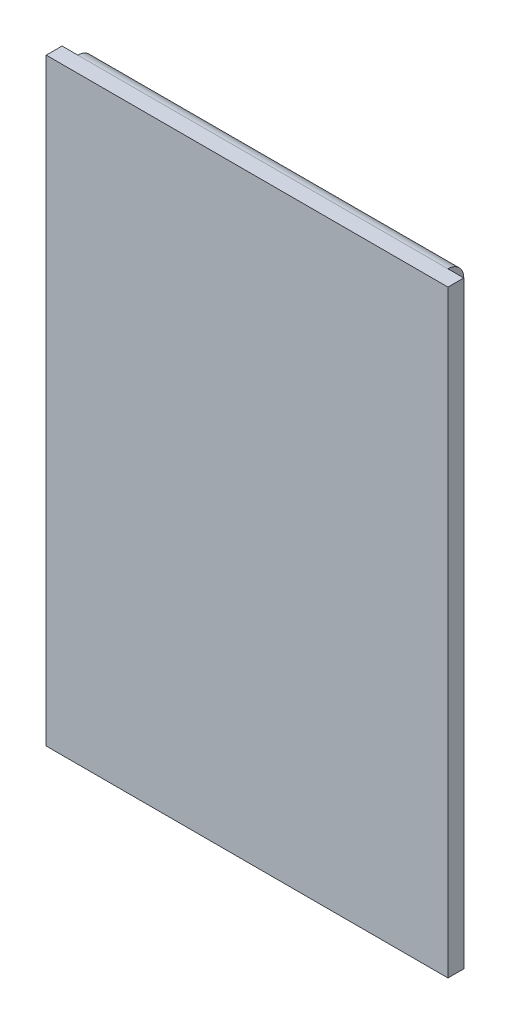
ISO-10303-21;
HEADER;
FILE_DESCRIPTION(('STEP AP214'),'2;1');
FILE_NAME('part.step','',(''),(''),'','','');
FILE_SCHEMA(('AUTOMOTIVE_DESIGN { 1 0 10303 214 1 1 1 1 }'));
ENDSEC;
DATA;
#1=APPLICATION_CONTEXT('core data for automotive mechanical design processes');
#2=APPLICATION_PROTOCOL_DEFINITION('international standard','automotive_design',2000,#1);
#3=PRODUCT_CONTEXT('',#1,'mechanical');
#4=PRODUCT('Part','Part','',(#3));
#5=PRODUCT_RELATED_PRODUCT_CATEGORY('part','',(#4));
#6=PRODUCT_DEFINITION_FORMATION('','',#4);
#7=PRODUCT_DEFINITION_CONTEXT('part definition',#1,'design');
#8=PRODUCT_DEFINITION('design','',#6,#7);
#9=PRODUCT_DEFINITION_SHAPE('','',#8);
#10=(LENGTH_UNIT() NAMED_UNIT(*) SI_UNIT(.MILLI.,.METRE.));
#11=(NAMED_UNIT(*) PLANE_ANGLE_UNIT() SI_UNIT($,.RADIAN.));
#12=(NAMED_UNIT(*) SI_UNIT($,.STERADIAN.) SOLID_ANGLE_UNIT());
#13=UNCERTAINTY_MEASURE_WITH_UNIT(LENGTH_MEASURE(1.E-05),#10,'distance_accuracy_value','');
#14=(GEOMETRIC_REPRESENTATION_CONTEXT(3) GLOBAL_UNCERTAINTY_ASSIGNED_CONTEXT((#13)) GLOBAL_UNIT_ASSIGNED_CONTEXT((#10,
#11,#12)) REPRESENTATION_CONTEXT('',''));
#15=CARTESIAN_POINT('',(0.,0.,0.));
#16=DIRECTION('',(0.,0.,1.));
#17=DIRECTION('',(1.,0.,0.));
#18=AXIS2_PLACEMENT_3D('',#15,#16,#17);
#19=CARTESIAN_POINT('',(-19.2071728395057,75.66,-15.2836751765689));
#20=DIRECTION('',(0.,0.,1.));
#21=DIRECTION('',(1.,0.,0.));
#22=AXIS2_PLACEMENT_3D('',#19,#20,#21);
#23=PLANE('',#22);
#24=DIRECTION('',(0.,-1.,0.));
#25=VECTOR('',#24,1.);
#26=CARTESIAN_POINT('',(-19.2071728395057,75.66,-15.2836751765689));
#27=LINE('',#26,#25);
#28=CARTESIAN_POINT('',(-19.2071728395057,73.66,-15.2836751765689));
#29=VERTEX_POINT('',#28);
#30=CARTESIAN_POINT('',(-19.2071728395057,2.,-15.2836751765689));
#31=VERTEX_POINT('',#30);
#32=EDGE_CURVE('E197',#29,#31,#27,.T.);
#33=ORIENTED_EDGE('',*,*,#32,.F.);
#34=DIRECTION('',(-1.,0.,0.));
#35=VECTOR('',#34,1.);
#36=CARTESIAN_POINT('',(27.5928271604943,73.66,-15.2836751765689));
#37=LINE('',#36,#35);
#38=CARTESIAN_POINT('',(27.5928271604943,73.66,-15.2836751765689));
#39=VERTEX_POINT('',#38);
#40=EDGE_CURVE('E43',#29,#39,#37,.F.);
#41=ORIENTED_EDGE('',*,*,#40,.T.);
#42=DIRECTION('',(0.,-1.,0.));
#43=VECTOR('',#42,1.);
#44=CARTESIAN_POINT('',(27.5928271604943,75.66,-15.2836751765689));
#45=LINE('',#44,#43);
#46=CARTESIAN_POINT('',(27.5928271604943,2.,-15.2836751765689));
#47=VERTEX_POINT('',#46);
#48=EDGE_CURVE('E199',#39,#47,#45,.T.);
#49=ORIENTED_EDGE('',*,*,#48,.T.);
#50=DIRECTION('',(1.,0.,0.));
#51=VECTOR('',#50,1.);
#52=CARTESIAN_POINT('',(-41.4071728395057,2.,-15.2836751765689));
#53=LINE('',#52,#51);
#54=EDGE_CURVE('E151',#31,#47,#53,.T.);
#55=ORIENTED_EDGE('',*,*,#54,.F.);
#56=EDGE_LOOP('',(#33,#41,#49,#55));
#57=FACE_BOUND('',#56,.T.);
#58=DIRECTION('',(1.,0.,0.));
#59=VECTOR('',#58,1.);
#60=CARTESIAN_POINT('',(0.,73.4413009949766,-15.2836751765689));
#61=LINE('',#60,#59);
#62=CARTESIAN_POINT('',(-2.61434567901141,73.4413009949766,-15.2836751765689));
#63=VERTEX_POINT('',#62);
#64=CARTESIAN_POINT('',(9.38565432098859,73.4413009949766,-15.2836751765689));
#65=VERTEX_POINT('',#64);
#66=EDGE_CURVE('E146',#63,#65,#61,.T.);
#67=ORIENTED_EDGE('',*,*,#66,.F.);
#68=DIRECTION('',(0.,-1.,0.));
#69=VECTOR('',#68,1.);
#70=CARTESIAN_POINT('',(-2.61434567901141,0.,-15.2836751765689));
#71=LINE('',#70,#69);
#72=CARTESIAN_POINT('',(-2.61434567901141,71.4413009949766,-15.2836751765689));
#73=VERTEX_POINT('',#72);
#74=EDGE_CURVE('E142',#63,#73,#71,.T.);
#75=ORIENTED_EDGE('',*,*,#74,.T.);
#76=DIRECTION('',(1.,0.,0.));
#77=VECTOR('',#76,1.);
#78=CARTESIAN_POINT('',(0.,71.4413009949766,-15.2836751765689));
#79=LINE('',#78,#77);
#80=CARTESIAN_POINT('',(9.38565432098859,71.4413009949766,-15.2836751765689));
#81=VERTEX_POINT('',#80);
#82=EDGE_CURVE('E50',#73,#81,#79,.T.);
#83=ORIENTED_EDGE('',*,*,#82,.T.);
#84=DIRECTION('',(0.,-1.,0.));
#85=VECTOR('',#84,1.);
#86=CARTESIAN_POINT('',(9.38565432098859,0.,-15.2836751765689));
#87=LINE('',#86,#85);
#88=EDGE_CURVE('E339',#65,#81,#87,.T.);
#89=ORIENTED_EDGE('',*,*,#88,.F.);
#90=EDGE_LOOP('',(#67,#75,#83,#89));
#91=FACE_BOUND('',#90,.T.);
#92=ADVANCED_FACE('F35',(#57,#91),#23,.F.);
#93=CARTESIAN_POINT('',(29.5928271604943,75.66,-13.2836751765689));
#94=DIRECTION('',(-1.,0.,0.));
#95=DIRECTION('',(0.,0.,1.));
#96=AXIS2_PLACEMENT_3D('',#93,#94,#95);
#97=PLANE('',#96);
#98=DIRECTION('',(0.,0.,-1.));
#99=VECTOR('',#98,1.);
#100=CARTESIAN_POINT('',(29.5928271604943,0.,-13.2836751765689));
#101=LINE('',#100,#99);
#102=CARTESIAN_POINT('',(29.5928271604943,0.,-11.2836751765689));
#103=VERTEX_POINT('',#102);
#104=CARTESIAN_POINT('',(29.5928271604943,0.,-13.2836751765689));
#105=VERTEX_POINT('',#104);
#106=EDGE_CURVE('E164',#103,#105,#101,.T.);
#107=ORIENTED_EDGE('',*,*,#106,.T.);
#108=DIRECTION('',(0.,-1.,0.));
#109=VECTOR('',#108,1.);
#110=CARTESIAN_POINT('',(29.5928271604943,75.66,-13.2836751765689));
#111=LINE('',#110,#109);
#112=CARTESIAN_POINT('',(29.5928271604943,75.66,-13.2836751765689));
#113=VERTEX_POINT('',#112);
#114=EDGE_CURVE('E204',#113,#105,#111,.T.);
#115=ORIENTED_EDGE('',*,*,#114,.F.);
#116=DIRECTION('',(0.,0.,-1.));
#117=VECTOR('',#116,1.);
#118=CARTESIAN_POINT('',(29.5928271604943,75.66,-13.2836751765689));
#119=LINE('',#118,#117);
#120=CARTESIAN_POINT('',(29.5928271604943,75.66,-11.2836751765689));
#121=VERTEX_POINT('',#120);
#122=EDGE_CURVE('E165',#121,#113,#119,.T.);
#123=ORIENTED_EDGE('',*,*,#122,.F.);
#124=DIRECTION('',(0.,-1.,0.));
#125=VECTOR('',#124,1.);
#126=CARTESIAN_POINT('',(29.5928271604943,75.66,-11.2836751765689));
#127=LINE('',#126,#125);
#128=EDGE_CURVE('E178',#121,#103,#127,.T.);
#129=ORIENTED_EDGE('',*,*,#128,.T.);
#130=EDGE_LOOP('',(#107,#115,#123,#129));
#131=FACE_BOUND('',#130,.T.);
#132=ADVANCED_FACE('F246',(#131),#97,.F.);
#133=CARTESIAN_POINT('',(27.5928271604943,75.66,-15.2836751765689));
#134=DIRECTION('',(-1.,0.,0.));
#135=DIRECTION('',(0.,0.,1.));
#136=AXIS2_PLACEMENT_3D('',#133,#134,#135);
#137=PLANE('',#136);
#138=ORIENTED_EDGE('',*,*,#48,.F.);
#139=CARTESIAN_POINT('',(27.5928271604943,73.66,-13.2836751765689));
#140=DIRECTION('',(-1.,0.,0.));
#141=DIRECTION('',(0.,0.,1.));
#142=AXIS2_PLACEMENT_3D('',#139,#140,#141);
#143=CIRCLE('',#142,2.);
#144=CARTESIAN_POINT('',(27.5928271604943,75.66,-13.2836751765689));
#145=VERTEX_POINT('',#144);
#146=EDGE_CURVE('E11',#39,#145,#143,.F.);
#147=ORIENTED_EDGE('',*,*,#146,.T.);
#148=DIRECTION('',(0.,-1.,0.));
#149=VECTOR('',#148,1.);
#150=CARTESIAN_POINT('',(27.5928271604943,75.66,-13.2836751765689));
#151=LINE('',#150,#149);
#152=CARTESIAN_POINT('',(27.5928271604943,2.,-13.2836751765689));
#153=VERTEX_POINT('',#152);
#154=EDGE_CURVE('E201',#145,#153,#151,.T.);
#155=ORIENTED_EDGE('',*,*,#154,.T.);
#156=DIRECTION('',(0.,0.,1.));
#157=VECTOR('',#156,1.);
#158=CARTESIAN_POINT('',(27.5928271604943,2.,-15.2836751765689));
#159=LINE('',#158,#157);
#160=EDGE_CURVE('E148',#47,#153,#159,.T.);
#161=ORIENTED_EDGE('',*,*,#160,.F.);
#162=EDGE_LOOP('',(#138,#147,#155,#161));
#163=FACE_BOUND('',#162,.T.);
#164=ADVANCED_FACE('F222',(#163),#137,.F.);
#165=CARTESIAN_POINT('',(-19.2071728395057,75.66,-15.2836751765689));
#166=DIRECTION('',(1.,0.,0.));
#167=DIRECTION('',(0.,0.,-1.));
#168=AXIS2_PLACEMENT_3D('',#165,#166,#167);
#169=PLANE('',#168);
#170=DIRECTION('',(0.,-1.,0.));
#171=VECTOR('',#170,1.);
#172=CARTESIAN_POINT('',(-19.2071728395057,75.66,-13.2836751765689));
#173=LINE('',#172,#171);
#174=CARTESIAN_POINT('',(-19.2071728395057,75.66,-13.2836751765689));
#175=VERTEX_POINT('',#174);
#176=CARTESIAN_POINT('',(-19.2071728395057,2.,-13.2836751765689));
#177=VERTEX_POINT('',#176);
#178=EDGE_CURVE('E194',#175,#177,#173,.T.);
#179=ORIENTED_EDGE('',*,*,#178,.F.);
#180=CARTESIAN_POINT('',(-19.2071728395057,73.66,-13.2836751765689));
#181=DIRECTION('',(1.,0.,0.));
#182=DIRECTION('',(0.,0.,-1.));
#183=AXIS2_PLACEMENT_3D('',#180,#181,#182);
#184=CIRCLE('',#183,2.);
#185=EDGE_CURVE('E210',#175,#29,#184,.F.);
#186=ORIENTED_EDGE('',*,*,#185,.T.);
#187=ORIENTED_EDGE('',*,*,#32,.T.);
#188=DIRECTION('',(0.,0.,1.));
#189=VECTOR('',#188,1.);
#190=CARTESIAN_POINT('',(-19.2071728395057,2.,-15.2836751765688));
#191=LINE('',#190,#189);
#192=EDGE_CURVE('E159',#31,#177,#191,.T.);
#193=ORIENTED_EDGE('',*,*,#192,.T.);
#194=EDGE_LOOP('',(#179,#186,#187,#193));
#195=FACE_BOUND('',#194,.T.);
#196=ADVANCED_FACE('F213',(#195),#169,.F.);
#197=CARTESIAN_POINT('',(-21.2071728395057,75.66,-13.2836751765689));
#198=DIRECTION('',(0.,0.,1.));
#199=DIRECTION('',(1.,0.,0.));
#200=AXIS2_PLACEMENT_3D('',#197,#198,#199);
#201=PLANE('',#200);
#202=ORIENTED_EDGE('',*,*,#178,.T.);
#203=DIRECTION('',(1.,0.,0.));
#204=VECTOR('',#203,1.);
#205=CARTESIAN_POINT('',(-41.4071728395057,2.,-13.2836751765689));
#206=LINE('',#205,#204);
#207=EDGE_CURVE('E157',#177,#153,#206,.T.);
#208=ORIENTED_EDGE('',*,*,#207,.T.);
#209=ORIENTED_EDGE('',*,*,#154,.F.);
#210=DIRECTION('',(-1.,0.,0.));
#211=VECTOR('',#210,1.);
#212=CARTESIAN_POINT('',(29.5928271604943,75.66,-13.2836751765689));
#213=LINE('',#212,#211);
#214=EDGE_CURVE('E168',#113,#145,#213,.T.);
#215=ORIENTED_EDGE('',*,*,#214,.F.);
#216=ORIENTED_EDGE('',*,*,#114,.T.);
#217=DIRECTION('',(-1.,0.,0.));
#218=VECTOR('',#217,1.);
#219=CARTESIAN_POINT('',(-21.2071728395057,0.,-13.2836751765689));
#220=LINE('',#219,#218);
#221=CARTESIAN_POINT('',(-21.2071728395057,0.,-13.2836751765689));
#222=VERTEX_POINT('',#221);
#223=EDGE_CURVE('E181',#105,#222,#220,.T.);
#224=ORIENTED_EDGE('',*,*,#223,.T.);
#225=DIRECTION('',(0.,-1.,0.));
#226=VECTOR('',#225,1.);
#227=CARTESIAN_POINT('',(-21.2071728395057,75.66,-13.2836751765689));
#228=LINE('',#227,#226);
#229=CARTESIAN_POINT('',(-21.2071728395057,75.66,-13.2836751765689));
#230=VERTEX_POINT('',#229);
#231=EDGE_CURVE('E192',#230,#222,#228,.T.);
#232=ORIENTED_EDGE('',*,*,#231,.F.);
#233=DIRECTION('',(-1.,0.,0.));
#234=VECTOR('',#233,1.);
#235=CARTESIAN_POINT('',(-21.2071728395057,75.66,-13.2836751765689));
#236=LINE('',#235,#234);
#237=EDGE_CURVE('E172',#175,#230,#236,.T.);
#238=ORIENTED_EDGE('',*,*,#237,.F.);
#239=EDGE_LOOP('',(#202,#208,#209,#215,#216,#224,#232,#238));
#240=FACE_BOUND('',#239,.T.);
#241=ADVANCED_FACE('F230',(#240),#201,.F.);
#242=CARTESIAN_POINT('',(-21.2071728395057,75.66,-13.2836751765689));
#243=DIRECTION('',(1.,0.,0.));
#244=DIRECTION('',(0.,0.,-1.));
#245=AXIS2_PLACEMENT_3D('',#242,#243,#244);
#246=PLANE('',#245);
#247=DIRECTION('',(0.,0.,1.));
#248=VECTOR('',#247,1.);
#249=CARTESIAN_POINT('',(-21.2071728395057,0.,-13.2836751765689));
#250=LINE('',#249,#248);
#251=CARTESIAN_POINT('',(-21.2071728395057,0.,-11.2836751765689));
#252=VERTEX_POINT('',#251);
#253=EDGE_CURVE('E184',#222,#252,#250,.T.);
#254=ORIENTED_EDGE('',*,*,#253,.T.);
#255=DIRECTION('',(0.,-1.,0.));
#256=VECTOR('',#255,1.);
#257=CARTESIAN_POINT('',(-21.2071728395057,75.66,-11.2836751765689));
#258=LINE('',#257,#256);
#259=CARTESIAN_POINT('',(-21.2071728395057,75.66,-11.2836751765689));
#260=VERTEX_POINT('',#259);
#261=EDGE_CURVE('E189',#260,#252,#258,.T.);
#262=ORIENTED_EDGE('',*,*,#261,.F.);
#263=DIRECTION('',(0.,0.,1.));
#264=VECTOR('',#263,1.);
#265=CARTESIAN_POINT('',(-21.2071728395057,75.66,-13.2836751765689));
#266=LINE('',#265,#264);
#267=EDGE_CURVE('E174',#230,#260,#266,.T.);
#268=ORIENTED_EDGE('',*,*,#267,.F.);
#269=ORIENTED_EDGE('',*,*,#231,.T.);
#270=EDGE_LOOP('',(#254,#262,#268,#269));
#271=FACE_BOUND('',#270,.T.);
#272=ADVANCED_FACE('F264',(#271),#246,.F.);
#273=CARTESIAN_POINT('',(-21.2071728395057,75.66,-11.2836751765689));
#274=DIRECTION('',(0.,0.,-1.));
#275=DIRECTION('',(-1.,0.,0.));
#276=AXIS2_PLACEMENT_3D('',#273,#274,#275);
#277=PLANE('',#276);
#278=DIRECTION('',(1.,0.,0.));
#279=VECTOR('',#278,1.);
#280=CARTESIAN_POINT('',(-21.2071728395057,0.,-11.2836751765689));
#281=LINE('',#280,#279);
#282=EDGE_CURVE('E169',#252,#103,#281,.T.);
#283=ORIENTED_EDGE('',*,*,#282,.T.);
#284=ORIENTED_EDGE('',*,*,#128,.F.);
#285=DIRECTION('',(1.,0.,0.));
#286=VECTOR('',#285,1.);
#287=CARTESIAN_POINT('',(-21.2071728395057,75.66,-11.2836751765689));
#288=LINE('',#287,#286);
#289=EDGE_CURVE('E176',#260,#121,#288,.T.);
#290=ORIENTED_EDGE('',*,*,#289,.F.);
#291=ORIENTED_EDGE('',*,*,#261,.T.);
#292=EDGE_LOOP('',(#283,#284,#290,#291));
#293=FACE_BOUND('',#292,.T.);
#294=ADVANCED_FACE('F269',(#293),#277,.F.);
#295=CARTESIAN_POINT('',(0.,75.66,0.));
#296=DIRECTION('',(0.,1.,0.));
#297=DIRECTION('',(0.,0.,1.));
#298=AXIS2_PLACEMENT_3D('',#295,#296,#297);
#299=PLANE('',#298);
#300=ORIENTED_EDGE('',*,*,#214,.T.);
#301=DIRECTION('',(-1.,0.,0.));
#302=VECTOR('',#301,1.);
#303=CARTESIAN_POINT('',(-19.2071728395057,75.66,-13.2836751765689));
#304=LINE('',#303,#302);
#305=EDGE_CURVE('E207',#145,#175,#304,.T.);
#306=ORIENTED_EDGE('',*,*,#305,.T.);
#307=ORIENTED_EDGE('',*,*,#237,.T.);
#308=ORIENTED_EDGE('',*,*,#267,.T.);
#309=ORIENTED_EDGE('',*,*,#289,.T.);
#310=ORIENTED_EDGE('',*,*,#122,.T.);
#311=EDGE_LOOP('',(#300,#306,#307,#308,#309,#310));
#312=FACE_BOUND('',#311,.T.);
#313=ADVANCED_FACE('F226',(#312),#299,.T.);
#314=CARTESIAN_POINT('',(0.,0.,0.));
#315=DIRECTION('',(0.,1.,0.));
#316=DIRECTION('',(0.,0.,1.));
#317=AXIS2_PLACEMENT_3D('',#314,#315,#316);
#318=PLANE('',#317);
#319=ORIENTED_EDGE('',*,*,#223,.F.);
#320=ORIENTED_EDGE('',*,*,#106,.F.);
#321=ORIENTED_EDGE('',*,*,#282,.F.);
#322=ORIENTED_EDGE('',*,*,#253,.F.);
#323=EDGE_LOOP('',(#319,#320,#321,#322));
#324=FACE_BOUND('',#323,.T.);
#325=ADVANCED_FACE('F234',(#324),#318,.F.);
#326=CARTESIAN_POINT('',(-41.4071728395057,2.,-15.2836751765689));
#327=DIRECTION('',(0.,1.,0.));
#328=DIRECTION('',(0.,0.,1.));
#329=AXIS2_PLACEMENT_3D('',#326,#327,#328);
#330=PLANE('',#329);
#331=ORIENTED_EDGE('',*,*,#54,.T.);
#332=ORIENTED_EDGE('',*,*,#160,.T.);
#333=ORIENTED_EDGE('',*,*,#207,.F.);
#334=ORIENTED_EDGE('',*,*,#192,.F.);
#335=EDGE_LOOP('',(#331,#332,#333,#334));
#336=FACE_BOUND('',#335,.T.);
#337=ADVANCED_FACE('F232',(#336),#330,.F.);
#338=CARTESIAN_POINT('',(0.,73.66,-13.2836751765689));
#339=DIRECTION('',(1.,0.,0.));
#340=DIRECTION('',(0.,0.,-1.));
#341=AXIS2_PLACEMENT_3D('',#338,#339,#340);
#342=CYLINDRICAL_SURFACE('',#341,2.);
#343=ORIENTED_EDGE('',*,*,#146,.F.);
#344=ORIENTED_EDGE('',*,*,#40,.F.);
#345=ORIENTED_EDGE('',*,*,#185,.F.);
#346=ORIENTED_EDGE('',*,*,#305,.F.);
#347=EDGE_LOOP('',(#343,#344,#345,#346));
#348=FACE_BOUND('',#347,.T.);
#349=ADVANCED_FACE('F37',(#348),#342,.T.);
#350=CARTESIAN_POINT('',(0.,73.4413009949766,-16.2836751765688));
#351=DIRECTION('',(0.,-1.,0.));
#352=DIRECTION('',(1.,0.,0.));
#353=AXIS2_PLACEMENT_3D('',#350,#351,#352);
#354=PLANE('',#353);
#355=ORIENTED_EDGE('',*,*,#66,.T.);
#356=DIRECTION('',(0.,0.,1.));
#357=VECTOR('',#356,1.);
#358=CARTESIAN_POINT('',(9.38565432098859,73.4413009949766,-16.2836751765688));
#359=LINE('',#358,#357);
#360=CARTESIAN_POINT('',(9.38565432098859,73.4413009949766,-16.2836751765688));
#361=VERTEX_POINT('',#360);
#362=EDGE_CURVE('E127',#361,#65,#359,.T.);
#363=ORIENTED_EDGE('',*,*,#362,.F.);
#364=DIRECTION('',(1.,0.,0.));
#365=VECTOR('',#364,1.);
#366=CARTESIAN_POINT('',(0.,73.4413009949766,-16.2836751765688));
#367=LINE('',#366,#365);
#368=CARTESIAN_POINT('',(-2.61434567901141,73.4413009949766,-16.2836751765688));
#369=VERTEX_POINT('',#368);
#370=EDGE_CURVE('E134',#369,#361,#367,.T.);
#371=ORIENTED_EDGE('',*,*,#370,.F.);
#372=DIRECTION('',(0.,0.,1.));
#373=VECTOR('',#372,1.);
#374=CARTESIAN_POINT('',(-2.61434567901141,73.4413009949766,-16.2836751765688));
#375=LINE('',#374,#373);
#376=EDGE_CURVE('E337',#369,#63,#375,.T.);
#377=ORIENTED_EDGE('',*,*,#376,.T.);
#378=EDGE_LOOP('',(#355,#363,#371,#377));
#379=FACE_BOUND('',#378,.T.);
#380=ADVANCED_FACE('F144',(#379),#354,.F.);
#381=CARTESIAN_POINT('',(9.38565432098859,0.,-16.2836751765688));
#382=DIRECTION('',(-1.,0.,0.));
#383=DIRECTION('',(0.,0.,1.));
#384=AXIS2_PLACEMENT_3D('',#381,#382,#383);
#385=PLANE('',#384);
#386=ORIENTED_EDGE('',*,*,#88,.T.);
#387=DIRECTION('',(0.,0.,1.));
#388=VECTOR('',#387,1.);
#389=CARTESIAN_POINT('',(9.38565432098859,71.4413009949766,-16.2836751765688));
#390=LINE('',#389,#388);
#391=CARTESIAN_POINT('',(9.38565432098859,71.4413009949766,-16.2836751765688));
#392=VERTEX_POINT('',#391);
#393=EDGE_CURVE('E129',#392,#81,#390,.T.);
#394=ORIENTED_EDGE('',*,*,#393,.F.);
#395=DIRECTION('',(0.,-1.,0.));
#396=VECTOR('',#395,1.);
#397=CARTESIAN_POINT('',(9.38565432098859,0.,-16.2836751765688));
#398=LINE('',#397,#396);
#399=EDGE_CURVE('E122',#361,#392,#398,.T.);
#400=ORIENTED_EDGE('',*,*,#399,.F.);
#401=ORIENTED_EDGE('',*,*,#362,.T.);
#402=EDGE_LOOP('',(#386,#394,#400,#401));
#403=FACE_BOUND('',#402,.T.);
#404=ADVANCED_FACE('F125',(#403),#385,.F.);
#405=CARTESIAN_POINT('',(0.,71.4413009949766,-16.2836751765688));
#406=DIRECTION('',(0.,-1.,0.));
#407=DIRECTION('',(0.,0.,-1.));
#408=AXIS2_PLACEMENT_3D('',#405,#406,#407);
#409=PLANE('',#408);
#410=ORIENTED_EDGE('',*,*,#82,.F.);
#411=DIRECTION('',(0.,0.,1.));
#412=VECTOR('',#411,1.);
#413=CARTESIAN_POINT('',(-2.61434567901141,71.4413009949766,-16.2836751765688));
#414=LINE('',#413,#412);
#415=CARTESIAN_POINT('',(-2.61434567901141,71.4413009949766,-16.2836751765688));
#416=VERTEX_POINT('',#415);
#417=EDGE_CURVE('E153',#416,#73,#414,.T.);
#418=ORIENTED_EDGE('',*,*,#417,.F.);
#419=DIRECTION('',(1.,0.,0.));
#420=VECTOR('',#419,1.);
#421=CARTESIAN_POINT('',(0.,71.4413009949766,-16.2836751765688));
#422=LINE('',#421,#420);
#423=EDGE_CURVE('E133',#416,#392,#422,.T.);
#424=ORIENTED_EDGE('',*,*,#423,.T.);
#425=ORIENTED_EDGE('',*,*,#393,.T.);
#426=EDGE_LOOP('',(#410,#418,#424,#425));
#427=FACE_BOUND('',#426,.T.);
#428=ADVANCED_FACE('F294',(#427),#409,.T.);
#429=CARTESIAN_POINT('',(-2.61434567901141,0.,-16.2836751765688));
#430=DIRECTION('',(-1.,0.,0.));
#431=DIRECTION('',(0.,0.,1.));
#432=AXIS2_PLACEMENT_3D('',#429,#430,#431);
#433=PLANE('',#432);
#434=ORIENTED_EDGE('',*,*,#74,.F.);
#435=ORIENTED_EDGE('',*,*,#376,.F.);
#436=DIRECTION('',(0.,-1.,0.));
#437=VECTOR('',#436,1.);
#438=CARTESIAN_POINT('',(-2.61434567901141,0.,-16.2836751765688));
#439=LINE('',#438,#437);
#440=EDGE_CURVE('E140',#369,#416,#439,.T.);
#441=ORIENTED_EDGE('',*,*,#440,.T.);
#442=ORIENTED_EDGE('',*,*,#417,.T.);
#443=EDGE_LOOP('',(#434,#435,#441,#442));
#444=FACE_BOUND('',#443,.T.);
#445=ADVANCED_FACE('F301',(#444),#433,.T.);
#446=CARTESIAN_POINT('',(0.,0.,-16.2836751765688));
#447=DIRECTION('',(0.,0.,-1.));
#448=DIRECTION('',(-1.,0.,0.));
#449=AXIS2_PLACEMENT_3D('',#446,#447,#448);
#450=PLANE('',#449);
#451=ORIENTED_EDGE('',*,*,#370,.T.);
#452=ORIENTED_EDGE('',*,*,#399,.T.);
#453=ORIENTED_EDGE('',*,*,#423,.F.);
#454=ORIENTED_EDGE('',*,*,#440,.F.);
#455=EDGE_LOOP('',(#451,#452,#453,#454));
#456=FACE_BOUND('',#455,.T.);
#457=ADVANCED_FACE('F138',(#456),#450,.T.);
#458=CLOSED_SHELL('',(#92,#132,#164,#196,#241,#272,#294,#313,#325,#337,#349,#380,#404,#428,#445,#457));
#459=MANIFOLD_SOLID_BREP('B2',#458);
#460=ADVANCED_BREP_SHAPE_REPRESENTATION('',(#18,#459),#14);
#461=SHAPE_DEFINITION_REPRESENTATION(#9,#460);
ENDSEC;
END-ISO-10303-21;
